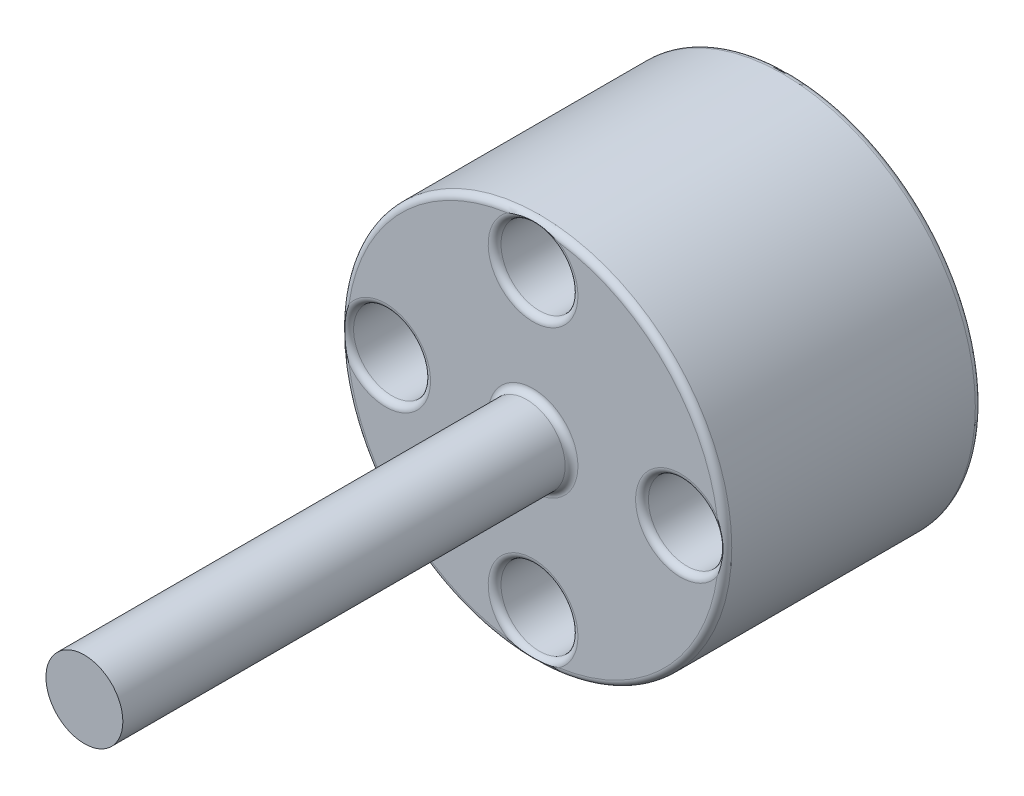
ISO-10303-21;
HEADER;
FILE_DESCRIPTION(('STEP AP214'),'2;1');
FILE_NAME('part.step','',(''),(''),'','','');
FILE_SCHEMA(('AUTOMOTIVE_DESIGN { 1 0 10303 214 1 1 1 1 }'));
ENDSEC;
DATA;
#1=APPLICATION_CONTEXT('core data for automotive mechanical design processes');
#2=APPLICATION_PROTOCOL_DEFINITION('international standard','automotive_design',2000,#1);
#3=PRODUCT_CONTEXT('',#1,'mechanical');
#4=PRODUCT('Part','Part','',(#3));
#5=PRODUCT_RELATED_PRODUCT_CATEGORY('part','',(#4));
#6=PRODUCT_DEFINITION_FORMATION('','',#4);
#7=PRODUCT_DEFINITION_CONTEXT('part definition',#1,'design');
#8=PRODUCT_DEFINITION('design','',#6,#7);
#9=PRODUCT_DEFINITION_SHAPE('','',#8);
#10=(LENGTH_UNIT() NAMED_UNIT(*) SI_UNIT(.MILLI.,.METRE.));
#11=(NAMED_UNIT(*) PLANE_ANGLE_UNIT() SI_UNIT($,.RADIAN.));
#12=(NAMED_UNIT(*) SI_UNIT($,.STERADIAN.) SOLID_ANGLE_UNIT());
#13=UNCERTAINTY_MEASURE_WITH_UNIT(LENGTH_MEASURE(1.E-05),#10,'distance_accuracy_value','');
#14=(GEOMETRIC_REPRESENTATION_CONTEXT(3) GLOBAL_UNCERTAINTY_ASSIGNED_CONTEXT((#13)) GLOBAL_UNIT_ASSIGNED_CONTEXT((#10,
#11,#12)) REPRESENTATION_CONTEXT('',''));
#15=CARTESIAN_POINT('',(0.,0.,0.));
#16=DIRECTION('',(0.,0.,1.));
#17=DIRECTION('',(1.,0.,0.));
#18=AXIS2_PLACEMENT_3D('',#15,#16,#17);
#19=CARTESIAN_POINT('',(0.,0.,2.));
#20=DIRECTION('',(0.,0.,-1.));
#21=DIRECTION('',(-1.,0.,0.));
#22=AXIS2_PLACEMENT_3D('',#19,#20,#21);
#23=CYLINDRICAL_SURFACE('',#22,1.5);
#24=CARTESIAN_POINT('',(0.,0.,0.0499999999999999));
#25=DIRECTION('',(0.,0.,1.));
#26=DIRECTION('',(1.,0.,0.));
#27=AXIS2_PLACEMENT_3D('',#24,#25,#26);
#28=CIRCLE('',#27,1.5);
#29=CARTESIAN_POINT('',(1.5,0.,0.0499999999999999));
#30=VERTEX_POINT('',#29);
#31=EDGE_CURVE('E11',#30,#30,#28,.T.);
#32=ORIENTED_EDGE('',*,*,#31,.T.);
#33=EDGE_LOOP('',(#32));
#34=FACE_BOUND('',#33,.T.);
#35=CARTESIAN_POINT('',(0.,0.,1.95));
#36=DIRECTION('',(0.,0.,1.));
#37=DIRECTION('',(1.,0.,0.));
#38=AXIS2_PLACEMENT_3D('',#35,#36,#37);
#39=CIRCLE('',#38,1.5);
#40=CARTESIAN_POINT('',(1.5,0.,1.95));
#41=VERTEX_POINT('',#40);
#42=EDGE_CURVE('E48',#41,#41,#39,.F.);
#43=ORIENTED_EDGE('',*,*,#42,.T.);
#44=EDGE_LOOP('',(#43));
#45=FACE_BOUND('',#44,.T.);
#46=ADVANCED_FACE('F35',(#34,#45),#23,.T.);
#47=CARTESIAN_POINT('',(0.,0.,2.));
#48=DIRECTION('',(0.,0.,1.));
#49=DIRECTION('',(1.,0.,0.));
#50=AXIS2_PLACEMENT_3D('',#47,#48,#49);
#51=PLANE('',#50);
#52=CARTESIAN_POINT('',(0.,0.,2.));
#53=DIRECTION('',(0.,0.,1.));
#54=DIRECTION('',(1.,0.,0.));
#55=AXIS2_PLACEMENT_3D('',#52,#53,#54);
#56=CIRCLE('',#55,0.35);
#57=CARTESIAN_POINT('',(0.35,0.,2.));
#58=VERTEX_POINT('',#57);
#59=EDGE_CURVE('E181',#58,#58,#56,.F.);
#60=ORIENTED_EDGE('',*,*,#59,.T.);
#61=EDGE_LOOP('',(#60));
#62=FACE_BOUND('',#61,.T.);
#63=CARTESIAN_POINT('',(1.15,0.,2.));
#64=DIRECTION('',(0.,0.,1.));
#65=DIRECTION('',(1.,0.,0.));
#66=AXIS2_PLACEMENT_3D('',#63,#64,#65);
#67=CIRCLE('',#66,0.35);
#68=CARTESIAN_POINT('',(1.43586956521739,-0.201937098331197,2.));
#69=VERTEX_POINT('',#68);
#70=CARTESIAN_POINT('',(1.43586956521739,0.201937098331177,2.));
#71=VERTEX_POINT('',#70);
#72=EDGE_CURVE('E61',#69,#71,#67,.F.);
#73=ORIENTED_EDGE('',*,*,#72,.T.);
#74=CARTESIAN_POINT('',(0.,0.,2.));
#75=DIRECTION('',(0.,0.,1.));
#76=DIRECTION('',(1.,0.,0.));
#77=AXIS2_PLACEMENT_3D('',#74,#75,#76);
#78=CIRCLE('',#77,1.45);
#79=CARTESIAN_POINT('',(0.201937098331192,1.43586956521739,2.));
#80=VERTEX_POINT('',#79);
#81=EDGE_CURVE('E56',#71,#80,#78,.T.);
#82=ORIENTED_EDGE('',*,*,#81,.T.);
#83=CARTESIAN_POINT('',(0.,1.15,2.));
#84=DIRECTION('',(0.,0.,1.));
#85=DIRECTION('',(1.,0.,0.));
#86=AXIS2_PLACEMENT_3D('',#83,#84,#85);
#87=CIRCLE('',#86,0.35);
#88=CARTESIAN_POINT('',(-0.201937098331182,1.43586956521739,2.));
#89=VERTEX_POINT('',#88);
#90=EDGE_CURVE('E178',#80,#89,#87,.F.);
#91=ORIENTED_EDGE('',*,*,#90,.T.);
#92=CARTESIAN_POINT('',(0.,0.,2.));
#93=DIRECTION('',(0.,0.,1.));
#94=DIRECTION('',(1.,0.,0.));
#95=AXIS2_PLACEMENT_3D('',#92,#93,#94);
#96=CIRCLE('',#95,1.45);
#97=CARTESIAN_POINT('',(-1.43586956521739,0.201937098331187,2.));
#98=VERTEX_POINT('',#97);
#99=EDGE_CURVE('E173',#89,#98,#96,.T.);
#100=ORIENTED_EDGE('',*,*,#99,.T.);
#101=CARTESIAN_POINT('',(-1.15,0.,2.));
#102=DIRECTION('',(0.,0.,1.));
#103=DIRECTION('',(1.,0.,0.));
#104=AXIS2_PLACEMENT_3D('',#101,#102,#103);
#105=CIRCLE('',#104,0.35);
#106=CARTESIAN_POINT('',(-1.43586956521739,-0.201937098331187,2.));
#107=VERTEX_POINT('',#106);
#108=EDGE_CURVE('E171',#98,#107,#105,.F.);
#109=ORIENTED_EDGE('',*,*,#108,.T.);
#110=CARTESIAN_POINT('',(0.,0.,2.));
#111=DIRECTION('',(0.,0.,1.));
#112=DIRECTION('',(1.,0.,0.));
#113=AXIS2_PLACEMENT_3D('',#110,#111,#112);
#114=CIRCLE('',#113,1.45);
#115=CARTESIAN_POINT('',(-0.201937098331203,-1.43586956521739,2.));
#116=VERTEX_POINT('',#115);
#117=EDGE_CURVE('E167',#107,#116,#114,.T.);
#118=ORIENTED_EDGE('',*,*,#117,.T.);
#119=CARTESIAN_POINT('',(0.,-1.15,2.));
#120=DIRECTION('',(0.,0.,1.));
#121=DIRECTION('',(1.,0.,0.));
#122=AXIS2_PLACEMENT_3D('',#119,#120,#121);
#123=CIRCLE('',#122,0.35);
#124=CARTESIAN_POINT('',(0.201937098331173,-1.43586956521739,2.));
#125=VERTEX_POINT('',#124);
#126=EDGE_CURVE('E169',#116,#125,#123,.F.);
#127=ORIENTED_EDGE('',*,*,#126,.T.);
#128=CARTESIAN_POINT('',(0.,0.,2.));
#129=DIRECTION('',(0.,0.,1.));
#130=DIRECTION('',(1.,0.,0.));
#131=AXIS2_PLACEMENT_3D('',#128,#129,#130);
#132=CIRCLE('',#131,1.45);
#133=EDGE_CURVE('E175',#125,#69,#132,.T.);
#134=ORIENTED_EDGE('',*,*,#133,.T.);
#135=EDGE_LOOP('',(#73,#82,#91,#100,#109,#118,#127,#134));
#136=FACE_BOUND('',#135,.T.);
#137=ADVANCED_FACE('F284',(#62,#136),#51,.T.);
#138=CARTESIAN_POINT('',(0.,0.,0.));
#139=DIRECTION('',(0.,0.,1.));
#140=DIRECTION('',(1.,0.,0.));
#141=AXIS2_PLACEMENT_3D('',#138,#139,#140);
#142=PLANE('',#141);
#143=CARTESIAN_POINT('',(-1.15,0.,0.));
#144=DIRECTION('',(0.,0.,1.));
#145=DIRECTION('',(1.,0.,0.));
#146=AXIS2_PLACEMENT_3D('',#143,#144,#145);
#147=CIRCLE('',#146,0.35);
#148=CARTESIAN_POINT('',(-1.43586956521739,-0.201937098331187,0.));
#149=VERTEX_POINT('',#148);
#150=CARTESIAN_POINT('',(-1.43586956521739,0.201937098331187,0.));
#151=VERTEX_POINT('',#150);
#152=EDGE_CURVE('E137',#149,#151,#147,.T.);
#153=ORIENTED_EDGE('',*,*,#152,.T.);
#154=CARTESIAN_POINT('',(0.,0.,0.));
#155=DIRECTION('',(0.,0.,1.));
#156=DIRECTION('',(1.,0.,0.));
#157=AXIS2_PLACEMENT_3D('',#154,#155,#156);
#158=CIRCLE('',#157,1.45);
#159=CARTESIAN_POINT('',(-0.201937098331182,1.43586956521739,0.));
#160=VERTEX_POINT('',#159);
#161=EDGE_CURVE('E141',#151,#160,#158,.F.);
#162=ORIENTED_EDGE('',*,*,#161,.T.);
#163=CARTESIAN_POINT('',(0.,1.15,0.));
#164=DIRECTION('',(0.,0.,1.));
#165=DIRECTION('',(1.,0.,0.));
#166=AXIS2_PLACEMENT_3D('',#163,#164,#165);
#167=CIRCLE('',#166,0.35);
#168=CARTESIAN_POINT('',(0.201937098331192,1.43586956521739,0.));
#169=VERTEX_POINT('',#168);
#170=EDGE_CURVE('E139',#160,#169,#167,.T.);
#171=ORIENTED_EDGE('',*,*,#170,.T.);
#172=CARTESIAN_POINT('',(0.,0.,0.));
#173=DIRECTION('',(0.,0.,1.));
#174=DIRECTION('',(1.,0.,0.));
#175=AXIS2_PLACEMENT_3D('',#172,#173,#174);
#176=CIRCLE('',#175,1.45);
#177=CARTESIAN_POINT('',(1.43586956521739,0.201937098331177,0.));
#178=VERTEX_POINT('',#177);
#179=EDGE_CURVE('E113',#169,#178,#176,.F.);
#180=ORIENTED_EDGE('',*,*,#179,.T.);
#181=CARTESIAN_POINT('',(1.15,0.,0.));
#182=DIRECTION('',(0.,0.,1.));
#183=DIRECTION('',(1.,0.,0.));
#184=AXIS2_PLACEMENT_3D('',#181,#182,#183);
#185=CIRCLE('',#184,0.35);
#186=CARTESIAN_POINT('',(1.43586956521739,-0.201937098331197,0.));
#187=VERTEX_POINT('',#186);
#188=EDGE_CURVE('E105',#178,#187,#185,.T.);
#189=ORIENTED_EDGE('',*,*,#188,.T.);
#190=CARTESIAN_POINT('',(0.,0.,0.));
#191=DIRECTION('',(0.,0.,1.));
#192=DIRECTION('',(1.,0.,0.));
#193=AXIS2_PLACEMENT_3D('',#190,#191,#192);
#194=CIRCLE('',#193,1.45);
#195=CARTESIAN_POINT('',(0.201937098331173,-1.43586956521739,0.));
#196=VERTEX_POINT('',#195);
#197=EDGE_CURVE('E109',#187,#196,#194,.F.);
#198=ORIENTED_EDGE('',*,*,#197,.T.);
#199=CARTESIAN_POINT('',(0.,-1.15,0.));
#200=DIRECTION('',(0.,0.,1.));
#201=DIRECTION('',(1.,0.,0.));
#202=AXIS2_PLACEMENT_3D('',#199,#200,#201);
#203=CIRCLE('',#202,0.35);
#204=CARTESIAN_POINT('',(-0.201937098331203,-1.43586956521739,0.));
#205=VERTEX_POINT('',#204);
#206=EDGE_CURVE('E116',#196,#205,#203,.T.);
#207=ORIENTED_EDGE('',*,*,#206,.T.);
#208=CARTESIAN_POINT('',(0.,0.,0.));
#209=DIRECTION('',(0.,0.,1.));
#210=DIRECTION('',(1.,0.,0.));
#211=AXIS2_PLACEMENT_3D('',#208,#209,#210);
#212=CIRCLE('',#211,1.45);
#213=EDGE_CURVE('E135',#205,#149,#212,.F.);
#214=ORIENTED_EDGE('',*,*,#213,.T.);
#215=EDGE_LOOP('',(#153,#162,#171,#180,#189,#198,#207,#214));
#216=FACE_BOUND('',#215,.T.);
#217=ADVANCED_FACE('F107',(#216),#142,.F.);
#218=CARTESIAN_POINT('',(0.,1.15,-1.));
#219=DIRECTION('',(0.,0.,1.));
#220=DIRECTION('',(1.,0.,0.));
#221=AXIS2_PLACEMENT_3D('',#218,#219,#220);
#222=CYLINDRICAL_SURFACE('',#221,0.3);
#223=CARTESIAN_POINT('',(0.,1.15,0.0499999999999999));
#224=DIRECTION('',(0.,0.,1.));
#225=DIRECTION('',(1.,0.,0.));
#226=AXIS2_PLACEMENT_3D('',#223,#224,#225);
#227=CIRCLE('',#226,0.3);
#228=CARTESIAN_POINT('',(0.300000000000004,1.15,0.0499999999999999));
#229=VERTEX_POINT('',#228);
#230=EDGE_CURVE('E146',#229,#229,#227,.F.);
#231=ORIENTED_EDGE('',*,*,#230,.T.);
#232=EDGE_LOOP('',(#231));
#233=FACE_BOUND('',#232,.T.);
#234=CARTESIAN_POINT('',(0.,1.15,1.95));
#235=DIRECTION('',(0.,0.,1.));
#236=DIRECTION('',(1.,0.,0.));
#237=AXIS2_PLACEMENT_3D('',#234,#235,#236);
#238=CIRCLE('',#237,0.3);
#239=CARTESIAN_POINT('',(0.300000000000004,1.15,1.95));
#240=VERTEX_POINT('',#239);
#241=EDGE_CURVE('E143',#240,#240,#238,.T.);
#242=ORIENTED_EDGE('',*,*,#241,.T.);
#243=EDGE_LOOP('',(#242));
#244=FACE_BOUND('',#243,.T.);
#245=ADVANCED_FACE('F294',(#233,#244),#222,.F.);
#246=CARTESIAN_POINT('',(-1.15,0.,-1.));
#247=DIRECTION('',(0.,0.,1.));
#248=DIRECTION('',(1.,0.,0.));
#249=AXIS2_PLACEMENT_3D('',#246,#247,#248);
#250=CYLINDRICAL_SURFACE('',#249,0.3);
#251=CARTESIAN_POINT('',(-1.15,0.,0.0499999999999999));
#252=DIRECTION('',(0.,0.,1.));
#253=DIRECTION('',(1.,0.,0.));
#254=AXIS2_PLACEMENT_3D('',#251,#252,#253);
#255=CIRCLE('',#254,0.3);
#256=CARTESIAN_POINT('',(-0.85,0.,0.0499999999999999));
#257=VERTEX_POINT('',#256);
#258=EDGE_CURVE('E152',#257,#257,#255,.F.);
#259=ORIENTED_EDGE('',*,*,#258,.T.);
#260=EDGE_LOOP('',(#259));
#261=FACE_BOUND('',#260,.T.);
#262=CARTESIAN_POINT('',(-1.15,0.,1.95));
#263=DIRECTION('',(0.,0.,1.));
#264=DIRECTION('',(1.,0.,0.));
#265=AXIS2_PLACEMENT_3D('',#262,#263,#264);
#266=CIRCLE('',#265,0.3);
#267=CARTESIAN_POINT('',(-0.85,0.,1.95));
#268=VERTEX_POINT('',#267);
#269=EDGE_CURVE('E149',#268,#268,#266,.T.);
#270=ORIENTED_EDGE('',*,*,#269,.T.);
#271=EDGE_LOOP('',(#270));
#272=FACE_BOUND('',#271,.T.);
#273=ADVANCED_FACE('F298',(#261,#272),#250,.F.);
#274=CARTESIAN_POINT('',(1.15,0.,-1.));
#275=DIRECTION('',(0.,0.,1.));
#276=DIRECTION('',(1.,0.,0.));
#277=AXIS2_PLACEMENT_3D('',#274,#275,#276);
#278=CYLINDRICAL_SURFACE('',#277,0.3);
#279=CARTESIAN_POINT('',(1.15,0.,0.0499999999999999));
#280=DIRECTION('',(0.,0.,1.));
#281=DIRECTION('',(1.,0.,0.));
#282=AXIS2_PLACEMENT_3D('',#279,#280,#281);
#283=CIRCLE('',#282,0.3);
#284=CARTESIAN_POINT('',(1.45,0.,0.0499999999999999));
#285=VERTEX_POINT('',#284);
#286=EDGE_CURVE('E158',#285,#285,#283,.F.);
#287=ORIENTED_EDGE('',*,*,#286,.T.);
#288=EDGE_LOOP('',(#287));
#289=FACE_BOUND('',#288,.T.);
#290=CARTESIAN_POINT('',(1.15,0.,1.95));
#291=DIRECTION('',(0.,0.,1.));
#292=DIRECTION('',(1.,0.,0.));
#293=AXIS2_PLACEMENT_3D('',#290,#291,#292);
#294=CIRCLE('',#293,0.3);
#295=CARTESIAN_POINT('',(1.45,0.,1.95));
#296=VERTEX_POINT('',#295);
#297=EDGE_CURVE('E155',#296,#296,#294,.T.);
#298=ORIENTED_EDGE('',*,*,#297,.T.);
#299=EDGE_LOOP('',(#298));
#300=FACE_BOUND('',#299,.T.);
#301=ADVANCED_FACE('F302',(#289,#300),#278,.F.);
#302=CARTESIAN_POINT('',(0.,-1.15,-1.));
#303=DIRECTION('',(0.,0.,1.));
#304=DIRECTION('',(1.,0.,0.));
#305=AXIS2_PLACEMENT_3D('',#302,#303,#304);
#306=CYLINDRICAL_SURFACE('',#305,0.3);
#307=CARTESIAN_POINT('',(0.,-1.15,0.0499999999999999));
#308=DIRECTION('',(0.,0.,1.));
#309=DIRECTION('',(1.,0.,0.));
#310=AXIS2_PLACEMENT_3D('',#307,#308,#309);
#311=CIRCLE('',#310,0.3);
#312=CARTESIAN_POINT('',(0.299999999999988,-1.15,0.0499999999999999));
#313=VERTEX_POINT('',#312);
#314=EDGE_CURVE('E164',#313,#313,#311,.F.);
#315=ORIENTED_EDGE('',*,*,#314,.T.);
#316=EDGE_LOOP('',(#315));
#317=FACE_BOUND('',#316,.T.);
#318=CARTESIAN_POINT('',(0.,-1.15,1.95));
#319=DIRECTION('',(0.,0.,1.));
#320=DIRECTION('',(1.,0.,0.));
#321=AXIS2_PLACEMENT_3D('',#318,#319,#320);
#322=CIRCLE('',#321,0.3);
#323=CARTESIAN_POINT('',(0.299999999999988,-1.15,1.95));
#324=VERTEX_POINT('',#323);
#325=EDGE_CURVE('E161',#324,#324,#322,.T.);
#326=ORIENTED_EDGE('',*,*,#325,.T.);
#327=EDGE_LOOP('',(#326));
#328=FACE_BOUND('',#327,.T.);
#329=ADVANCED_FACE('F306',(#317,#328),#306,.F.);
#330=CARTESIAN_POINT('',(0.,0.,5.5));
#331=DIRECTION('',(0.,0.,-1.));
#332=DIRECTION('',(-1.,0.,0.));
#333=AXIS2_PLACEMENT_3D('',#330,#331,#332);
#334=CYLINDRICAL_SURFACE('',#333,0.3);
#335=CARTESIAN_POINT('',(0.,0.,2.05));
#336=DIRECTION('',(0.,0.,1.));
#337=DIRECTION('',(1.,0.,0.));
#338=AXIS2_PLACEMENT_3D('',#335,#336,#337);
#339=CIRCLE('',#338,0.3);
#340=CARTESIAN_POINT('',(0.3,0.,2.05));
#341=VERTEX_POINT('',#340);
#342=EDGE_CURVE('E184',#341,#341,#339,.T.);
#343=ORIENTED_EDGE('',*,*,#342,.T.);
#344=EDGE_LOOP('',(#343));
#345=FACE_BOUND('',#344,.T.);
#346=CARTESIAN_POINT('',(0.,0.,5.5));
#347=DIRECTION('',(0.,0.,1.));
#348=DIRECTION('',(1.,0.,0.));
#349=AXIS2_PLACEMENT_3D('',#346,#347,#348);
#350=CIRCLE('',#349,0.3);
#351=CARTESIAN_POINT('',(0.3,0.,5.5));
#352=VERTEX_POINT('',#351);
#353=EDGE_CURVE('E121',#352,#352,#350,.T.);
#354=ORIENTED_EDGE('',*,*,#353,.F.);
#355=EDGE_LOOP('',(#354));
#356=FACE_BOUND('',#355,.T.);
#357=ADVANCED_FACE('F310',(#345,#356),#334,.T.);
#358=CARTESIAN_POINT('',(0.,0.,5.5));
#359=DIRECTION('',(0.,0.,1.));
#360=DIRECTION('',(1.,0.,0.));
#361=AXIS2_PLACEMENT_3D('',#358,#359,#360);
#362=PLANE('',#361);
#363=ORIENTED_EDGE('',*,*,#353,.T.);
#364=EDGE_LOOP('',(#363));
#365=FACE_BOUND('',#364,.T.);
#366=ADVANCED_FACE('F242',(#365),#362,.T.);
#367=CARTESIAN_POINT('',(1.15,0.,0.0499999999999999));
#368=DIRECTION('',(0.,0.,1.));
#369=DIRECTION('',(1.,0.,0.));
#370=AXIS2_PLACEMENT_3D('',#367,#368,#369);
#371=TOROIDAL_SURFACE('',#370,0.35,0.05);
#372=ORIENTED_EDGE('',*,*,#286,.F.);
#373=EDGE_LOOP('',(#372));
#374=FACE_BOUND('',#373,.T.);
#375=CARTESIAN_POINT('',(1.43586956521739,-0.201937098331198,0.));
#376=CARTESIAN_POINT('',(1.43612634153744,-0.201289268184827,1.12791402955893E-08));
#377=CARTESIAN_POINT('',(1.43638195279791,-0.200640961265069,8.17622507175354E-07));
#378=CARTESIAN_POINT('',(1.44275013630169,-0.184403345825394,4.04246720203178E-05));
#379=CARTESIAN_POINT('',(1.44818914714311,-0.168542223917562,0.000526564702538975));
#380=CARTESIAN_POINT('',(1.45762581674346,-0.136389331563745,0.00187201254583861));
#381=CARTESIAN_POINT('',(1.46162084194712,-0.12009683184701,0.00273199595092352));
#382=CARTESIAN_POINT('',(1.46768296661211,-0.0892960083221013,0.00427608932695745));
#383=CARTESIAN_POINT('',(1.46993040489774,-0.0748236904997125,0.00496866790024452));
#384=CARTESIAN_POINT('',(1.47323493196302,-0.0457332837419883,0.00605048074632255));
#385=CARTESIAN_POINT('',(1.47429224007455,-0.0311152221672446,0.00643977090876729));
#386=CARTESIAN_POINT('',(1.4751981216962,-0.00183411451243005,0.00677051651445692));
#387=CARTESIAN_POINT('',(1.47504656846501,0.0128289361233494,0.00671192500022595));
#388=CARTESIAN_POINT('',(1.47353772456414,0.0420805911423185,0.00616959317882667));
#389=CARTESIAN_POINT('',(1.47218062216764,0.0566692067923932,0.00568591925781572));
#390=CARTESIAN_POINT('',(1.46756214595278,0.0910482283294351,0.00424387340364925));
#391=CARTESIAN_POINT('',(1.4637817778277,0.110764863478096,0.00317605207512468));
#392=CARTESIAN_POINT('',(1.45410065794233,0.149653589950277,0.00126818731673808));
#393=CARTESIAN_POINT('',(1.44820344993497,0.168826533916593,0.000427767298987984));
#394=CARTESIAN_POINT('',(1.43980612625028,0.191772624671087,5.40282333038937E-05));
#395=CARTESIAN_POINT('',(1.43824465498474,0.195891506099508,1.24823253110957E-05));
#396=CARTESIAN_POINT('',(1.43638195535113,0.200640944478411,8.05200992356022E-07));
#397=CARTESIAN_POINT('',(1.43612634402928,0.201289250493394,-2.32826666588271E-09));
#398=CARTESIAN_POINT('',(1.43586956521739,0.201937098331177,0.));
#399=B_SPLINE_CURVE_WITH_KNOTS('',3,(#375,#376,#377,#378,#379,#380,#381,#382,#383,#384,#385,
#386,#387,#388,#389,#390,#391,#392,#393,#394,#395,#396,#397,#398),.UNSPECIFIED.,.F.,.F.,(4,2,2,
2,2,2,2,2,2,2,2,4),(0.,0.00209062932104279,0.0523242262657676,0.102648982883692,
0.146586460966601,0.190515840383101,0.234449825571998,0.278376950702154,0.338566935362562,
0.398656623722513,0.41187102163676,0.413961650960952),.UNSPECIFIED.);
#400=EDGE_CURVE('E118',#187,#178,#399,.T.);
#401=ORIENTED_EDGE('',*,*,#400,.F.);
#402=ORIENTED_EDGE('',*,*,#188,.F.);
#403=EDGE_LOOP('',(#401,#402));
#404=FACE_BOUND('',#403,.T.);
#405=ADVANCED_FACE('F119',(#374,#404),#371,.T.);
#406=CARTESIAN_POINT('',(0.,-1.15,0.0499999999999999));
#407=DIRECTION('',(0.,0.,1.));
#408=DIRECTION('',(1.,0.,0.));
#409=AXIS2_PLACEMENT_3D('',#406,#407,#408);
#410=TOROIDAL_SURFACE('',#409,0.35,0.05);
#411=ORIENTED_EDGE('',*,*,#314,.F.);
#412=EDGE_LOOP('',(#411));
#413=FACE_BOUND('',#412,.T.);
#414=CARTESIAN_POINT('',(-0.201937098331203,-1.43586956521739,0.));
#415=CARTESIAN_POINT('',(-0.201289268184834,-1.43612634153744,1.12791840049309E-08));
#416=CARTESIAN_POINT('',(-0.200640961265076,-1.43638195279791,8.17622528266505E-07));
#417=CARTESIAN_POINT('',(-0.184403345825408,-1.44275013630169,4.0424671513385E-05));
#418=CARTESIAN_POINT('',(-0.168542223917583,-1.44818914714311,0.000526564702403194));
#419=CARTESIAN_POINT('',(-0.136389331563766,-1.45762581674346,0.00187201254597333));
#420=CARTESIAN_POINT('',(-0.120096831847025,-1.46162084194711,0.00273199595095703));
#421=CARTESIAN_POINT('',(-0.0892960083221094,-1.46768296661211,0.0042760893269276));
#422=CARTESIAN_POINT('',(-0.0748236904997207,-1.46993040489773,0.00496866790023649));
#423=CARTESIAN_POINT('',(-0.0457332837419956,-1.47323493196302,0.00605048074633053));
#424=CARTESIAN_POINT('',(-0.0311152221672511,-1.47429224007454,0.00643977090876945));
#425=CARTESIAN_POINT('',(-0.00183411451243592,-1.4751981216962,0.00677051651445479));
#426=CARTESIAN_POINT('',(0.0128289361233433,-1.47504656846501,0.0067119250002254));
#427=CARTESIAN_POINT('',(0.0420805911423118,-1.47353772456414,0.00616959317882731));
#428=CARTESIAN_POINT('',(0.0566692067923864,-1.47218062216764,0.00568591925781597));
#429=CARTESIAN_POINT('',(0.091048228329429,-1.46756214595278,0.00424387340364907));
#430=CARTESIAN_POINT('',(0.110764863478091,-1.4637817778277,0.00317605207512463));
#431=CARTESIAN_POINT('',(0.149653589950273,-1.45410065794233,0.00126818731673813));
#432=CARTESIAN_POINT('',(0.168826533916589,-1.44820344993497,0.00042776729898798));
#433=CARTESIAN_POINT('',(0.191772624671082,-1.43980612625028,5.40282333038956E-05));
#434=CARTESIAN_POINT('',(0.195891506099503,-1.43824465498474,1.24823253111013E-05));
#435=CARTESIAN_POINT('',(0.200640944478406,-1.43638195535113,8.05200992354519E-07));
#436=CARTESIAN_POINT('',(0.201289250493389,-1.43612634402929,-2.32826666860033E-09));
#437=CARTESIAN_POINT('',(0.201937098331173,-1.43586956521739,0.));
#438=B_SPLINE_CURVE_WITH_KNOTS('',3,(#414,#415,#416,#417,#418,#419,#420,#421,#422,#423,#424,
#425,#426,#427,#428,#429,#430,#431,#432,#433,#434,#435,#436,#437),.UNSPECIFIED.,.F.,.F.,(4,2,2,
2,2,2,2,2,2,2,2,4),(0.,0.00209062932103901,0.052324226265744,0.102648982883688,
0.146586460966598,0.190515840383101,0.234449825571997,0.278376950702152,0.338566935362563,
0.398656623722514,0.411871021636761,0.413961650960953),.UNSPECIFIED.);
#439=EDGE_CURVE('E122',#205,#196,#438,.T.);
#440=ORIENTED_EDGE('',*,*,#439,.F.);
#441=ORIENTED_EDGE('',*,*,#206,.F.);
#442=EDGE_LOOP('',(#440,#441));
#443=FACE_BOUND('',#442,.T.);
#444=ADVANCED_FACE('F218',(#413,#443),#410,.T.);
#445=CARTESIAN_POINT('',(-1.15,0.,0.0499999999999999));
#446=DIRECTION('',(0.,0.,1.));
#447=DIRECTION('',(1.,0.,0.));
#448=AXIS2_PLACEMENT_3D('',#445,#446,#447);
#449=TOROIDAL_SURFACE('',#448,0.35,0.05);
#450=ORIENTED_EDGE('',*,*,#258,.F.);
#451=EDGE_LOOP('',(#450));
#452=FACE_BOUND('',#451,.T.);
#453=CARTESIAN_POINT('',(-1.43586956521739,0.201937098331187,0.));
#454=CARTESIAN_POINT('',(-1.43612634153744,0.201289268184818,1.12791840245291E-08));
#455=CARTESIAN_POINT('',(-1.43638195279791,0.200640961265061,8.17622528271499E-07));
#456=CARTESIAN_POINT('',(-1.44275013630169,0.184403345825393,4.04246715130482E-05));
#457=CARTESIAN_POINT('',(-1.44818914714311,0.168542223917568,0.000526564702403076));
#458=CARTESIAN_POINT('',(-1.45762581674346,0.136389331563751,0.00187201254597336));
#459=CARTESIAN_POINT('',(-1.46162084194712,0.12009683184701,0.00273199595095699));
#460=CARTESIAN_POINT('',(-1.46768296661211,0.0892960083220947,0.00427608932692751));
#461=CARTESIAN_POINT('',(-1.46993040489774,0.0748236904997057,0.00496866790023641));
#462=CARTESIAN_POINT('',(-1.47323493196302,0.0457332837419801,0.00605048074633047));
#463=CARTESIAN_POINT('',(-1.47429224007455,0.0311152221672354,0.00643977090876942));
#464=CARTESIAN_POINT('',(-1.4751981216962,0.00183411451242001,0.00677051651445481));
#465=CARTESIAN_POINT('',(-1.47504656846501,-0.0128289361233592,0.00671192500022545));
#466=CARTESIAN_POINT('',(-1.47353772456414,-0.0420805911423278,0.00616959317882733));
#467=CARTESIAN_POINT('',(-1.47218062216764,-0.0566692067924024,0.00568591925781594));
#468=CARTESIAN_POINT('',(-1.46756214595278,-0.0910482283294448,0.00424387340364902));
#469=CARTESIAN_POINT('',(-1.46378177782769,-0.110764863478106,0.00317605207512465));
#470=CARTESIAN_POINT('',(-1.45410065794233,-0.149653589950288,0.00126818731673811));
#471=CARTESIAN_POINT('',(-1.44820344993497,-0.168826533916603,0.000427767298987851));
#472=CARTESIAN_POINT('',(-1.43980612625028,-0.191772624671096,5.40282333039323E-05));
#473=CARTESIAN_POINT('',(-1.43824465498474,-0.195891506099518,1.24823253111796E-05));
#474=CARTESIAN_POINT('',(-1.43638195535112,-0.200640944478421,8.05200992352326E-07));
#475=CARTESIAN_POINT('',(-1.43612634402928,-0.201289250493404,-2.32826668459592E-09));
#476=CARTESIAN_POINT('',(-1.43586956521739,-0.201937098331187,0.));
#477=B_SPLINE_CURVE_WITH_KNOTS('',3,(#453,#454,#455,#456,#457,#458,#459,#460,#461,#462,#463,
#464,#465,#466,#467,#468,#469,#470,#471,#472,#473,#474,#475,#476),.UNSPECIFIED.,.F.,.F.,(4,2,2,
2,2,2,2,2,2,2,2,4),(0.,0.00209062932103899,0.0523242262657429,0.102648982883687,
0.146586460966597,0.190515840383101,0.234449825571997,0.278376950702152,0.338566935362562,
0.398656623722512,0.41187102163676,0.413961650960951),.UNSPECIFIED.);
#478=EDGE_CURVE('E196',#151,#149,#477,.T.);
#479=ORIENTED_EDGE('',*,*,#478,.F.);
#480=ORIENTED_EDGE('',*,*,#152,.F.);
#481=EDGE_LOOP('',(#479,#480));
#482=FACE_BOUND('',#481,.T.);
#483=ADVANCED_FACE('F209',(#452,#482),#449,.T.);
#484=CARTESIAN_POINT('',(0.,0.,0.0499999999999999));
#485=DIRECTION('',(0.,0.,1.));
#486=DIRECTION('',(1.,0.,0.));
#487=AXIS2_PLACEMENT_3D('',#484,#485,#486);
#488=TOROIDAL_SURFACE('',#487,1.45,0.05);
#489=ORIENTED_EDGE('',*,*,#31,.F.);
#490=EDGE_LOOP('',(#489));
#491=FACE_BOUND('',#490,.T.);
#492=CARTESIAN_POINT('',(-0.201937098331182,1.43586956521739,0.));
#493=CARTESIAN_POINT('',(-0.201289268184812,1.43612634153744,1.1279140292647E-08));
#494=CARTESIAN_POINT('',(-0.200640961265053,1.43638195279791,8.17622507171679E-07));
#495=CARTESIAN_POINT('',(-0.184403345825378,1.44275013630169,4.04246720202967E-05));
#496=CARTESIAN_POINT('',(-0.168542223917546,1.44818914714312,0.000526564702538959));
#497=CARTESIAN_POINT('',(-0.136389331563729,1.45762581674346,0.0018720125458386));
#498=CARTESIAN_POINT('',(-0.120096831846994,1.46162084194712,0.00273199595092352));
#499=CARTESIAN_POINT('',(-0.0892960083220857,1.46768296661211,0.00427608932695745));
#500=CARTESIAN_POINT('',(-0.0748236904996971,1.46993040489774,0.00496866790024453));
#501=CARTESIAN_POINT('',(-0.0457332837419731,1.47323493196302,0.00605048074632251));
#502=CARTESIAN_POINT('',(-0.0311152221672295,1.47429224007455,0.00643977090876721));
#503=CARTESIAN_POINT('',(-0.00183411451241504,1.4751981216962,0.00677051651445682));
#504=CARTESIAN_POINT('',(0.0128289361233645,1.47504656846501,0.00671192500022587));
#505=CARTESIAN_POINT('',(0.0420805911423336,1.47353772456414,0.00616959317882661));
#506=CARTESIAN_POINT('',(0.0566692067924084,1.47218062216764,0.00568591925781566));
#507=CARTESIAN_POINT('',(0.0910482283294503,1.46756214595278,0.00424387340364919));
#508=CARTESIAN_POINT('',(0.110764863478111,1.46378177782769,0.00317605207512462));
#509=CARTESIAN_POINT('',(0.149653589950293,1.45410065794233,0.00126818731673805));
#510=CARTESIAN_POINT('',(0.168826533916609,1.44820344993497,0.000427767298987955));
#511=CARTESIAN_POINT('',(0.191772624671101,1.43980612625028,5.40282333039089E-05));
#512=CARTESIAN_POINT('',(0.195891506099522,1.43824465498473,1.24823253111202E-05));
#513=CARTESIAN_POINT('',(0.200640944478425,1.43638195535112,8.05200992359305E-07));
#514=CARTESIAN_POINT('',(0.201289250493408,1.43612634402928,-2.32826666619648E-09));
#515=CARTESIAN_POINT('',(0.201937098331192,1.43586956521739,0.));
#516=B_SPLINE_CURVE_WITH_KNOTS('',3,(#492,#493,#494,#495,#496,#497,#498,#499,#500,#501,#502,
#503,#504,#505,#506,#507,#508,#509,#510,#511,#512,#513,#514,#515),.UNSPECIFIED.,.F.,.F.,(4,2,2,
2,2,2,2,2,2,2,2,4),(0.,0.00209062932104279,0.0523242262657674,0.102648982883691,0.1465864609666,
0.1905158403831,0.234449825571997,0.278376950702153,0.338566935362562,0.398656623722512,
0.411871021636759,0.413961650960951),.UNSPECIFIED.);
#517=EDGE_CURVE('E189',#160,#169,#516,.T.);
#518=ORIENTED_EDGE('',*,*,#517,.F.);
#519=ORIENTED_EDGE('',*,*,#161,.F.);
#520=ORIENTED_EDGE('',*,*,#478,.T.);
#521=ORIENTED_EDGE('',*,*,#213,.F.);
#522=ORIENTED_EDGE('',*,*,#439,.T.);
#523=ORIENTED_EDGE('',*,*,#197,.F.);
#524=ORIENTED_EDGE('',*,*,#400,.T.);
#525=ORIENTED_EDGE('',*,*,#179,.F.);
#526=EDGE_LOOP('',(#518,#519,#520,#521,#522,#523,#524,#525));
#527=FACE_BOUND('',#526,.T.);
#528=ADVANCED_FACE('F126',(#491,#527),#488,.T.);
#529=CARTESIAN_POINT('',(0.,1.15,0.0499999999999999));
#530=DIRECTION('',(0.,0.,1.));
#531=DIRECTION('',(1.,0.,0.));
#532=AXIS2_PLACEMENT_3D('',#529,#530,#531);
#533=TOROIDAL_SURFACE('',#532,0.35,0.05);
#534=ORIENTED_EDGE('',*,*,#230,.F.);
#535=EDGE_LOOP('',(#534));
#536=FACE_BOUND('',#535,.T.);
#537=ORIENTED_EDGE('',*,*,#170,.F.);
#538=ORIENTED_EDGE('',*,*,#517,.T.);
#539=EDGE_LOOP('',(#537,#538));
#540=FACE_BOUND('',#539,.T.);
#541=ADVANCED_FACE('F208',(#536,#540),#533,.T.);
#542=CARTESIAN_POINT('',(-1.15,0.,1.95));
#543=DIRECTION('',(0.,0.,1.));
#544=DIRECTION('',(1.,0.,0.));
#545=AXIS2_PLACEMENT_3D('',#542,#543,#544);
#546=TOROIDAL_SURFACE('',#545,0.35,0.05);
#547=ORIENTED_EDGE('',*,*,#269,.F.);
#548=EDGE_LOOP('',(#547));
#549=FACE_BOUND('',#548,.T.);
#550=CARTESIAN_POINT('',(-1.43586956521739,-0.201937098331187,2.));
#551=CARTESIAN_POINT('',(-1.43612634153744,-0.201289268184817,1.99999998872082));
#552=CARTESIAN_POINT('',(-1.4363819527979,-0.200640961265058,1.99999918237747));
#553=CARTESIAN_POINT('',(-1.44275013630161,-0.184403345825349,1.99995957532848));
#554=CARTESIAN_POINT('',(-1.44818914714309,-0.168542223917538,1.9994734352976));
#555=CARTESIAN_POINT('',(-1.45762581674349,-0.136389331563723,1.99812798745403));
#556=CARTESIAN_POINT('',(-1.46162084194713,-0.12009683184697,1.99726800404904));
#557=CARTESIAN_POINT('',(-1.46768296661211,-0.0892960083220498,1.99572391067307));
#558=CARTESIAN_POINT('',(-1.46993040489774,-0.0748236904996665,1.99503133209976));
#559=CARTESIAN_POINT('',(-1.47323493196303,-0.0457332837419516,1.99394951925367));
#560=CARTESIAN_POINT('',(-1.47429224007455,-0.031115222167212,1.99356022909123));
#561=CARTESIAN_POINT('',(-1.47519812169619,-0.00183411451239874,1.99322948348555));
#562=CARTESIAN_POINT('',(-1.47504656846501,0.0128289361233835,1.99328807499977));
#563=CARTESIAN_POINT('',(-1.47353772456413,0.0420805911423588,1.99383040682117));
#564=CARTESIAN_POINT('',(-1.47218062216764,0.0566692067924371,1.99431408074219));
#565=CARTESIAN_POINT('',(-1.46756214595277,0.0910482283294782,1.99575612659635));
#566=CARTESIAN_POINT('',(-1.46378177782767,0.110764863478134,1.99682394792488));
#567=CARTESIAN_POINT('',(-1.45410065794233,0.149653589950314,1.99873181268326));
#568=CARTESIAN_POINT('',(-1.44820344993502,0.168826533916634,1.99957223270101));
#569=CARTESIAN_POINT('',(-1.43980612625027,0.191772624671094,1.9999459717667));
#570=CARTESIAN_POINT('',(-1.43824465498471,0.195891506099508,1.99998751767469));
#571=CARTESIAN_POINT('',(-1.43638195535112,0.200640944478417,1.99999919479901));
#572=CARTESIAN_POINT('',(-1.43612634402928,0.201289250493402,2.00000000232827));
#573=CARTESIAN_POINT('',(-1.43586956521739,0.201937098331187,2.));
#574=B_SPLINE_CURVE_WITH_KNOTS('',3,(#550,#551,#552,#553,#554,#555,#556,#557,#558,#559,#560,
#561,#562,#563,#564,#565,#566,#567,#568,#569,#570,#571,#572,#573),.UNSPECIFIED.,.F.,.F.,(4,2,2,
2,2,2,2,2,2,2,2,4),(0.,0.00209062932103903,0.0523242262657759,0.102648982883734,
0.146586460966631,0.190515840383118,0.234449825572024,0.278376950702189,0.338566935362593,
0.398656623722515,0.411871021636759,0.41396165096095),.UNSPECIFIED.);
#575=EDGE_CURVE('E39',#107,#98,#574,.T.);
#576=ORIENTED_EDGE('',*,*,#575,.F.);
#577=ORIENTED_EDGE('',*,*,#108,.F.);
#578=EDGE_LOOP('',(#576,#577));
#579=FACE_BOUND('',#578,.T.);
#580=ADVANCED_FACE('F212',(#549,#579),#546,.T.);
#581=CARTESIAN_POINT('',(0.,-1.15,1.95));
#582=DIRECTION('',(0.,0.,1.));
#583=DIRECTION('',(1.,0.,0.));
#584=AXIS2_PLACEMENT_3D('',#581,#582,#583);
#585=TOROIDAL_SURFACE('',#584,0.35,0.05);
#586=ORIENTED_EDGE('',*,*,#325,.F.);
#587=EDGE_LOOP('',(#586));
#588=FACE_BOUND('',#587,.T.);
#589=CARTESIAN_POINT('',(0.201937098331173,-1.43586956521739,2.));
#590=CARTESIAN_POINT('',(0.201289268184802,-1.43612634153744,1.99999998872082));
#591=CARTESIAN_POINT('',(0.200640961265043,-1.43638195279791,1.99999918237747));
#592=CARTESIAN_POINT('',(0.184403345825333,-1.44275013630161,1.99995957532849));
#593=CARTESIAN_POINT('',(0.168542223917522,-1.4481891471431,1.9994734352976));
#594=CARTESIAN_POINT('',(0.136389331563708,-1.45762581674349,1.99812798745402));
#595=CARTESIAN_POINT('',(0.120096831846955,-1.46162084194713,1.99726800404904));
#596=CARTESIAN_POINT('',(0.0892960083220342,-1.46768296661212,1.99572391067307));
#597=CARTESIAN_POINT('',(0.074823690499651,-1.46993040489774,1.99503133209976));
#598=CARTESIAN_POINT('',(0.0457332837419362,-1.47323493196303,1.99394951925367));
#599=CARTESIAN_POINT('',(0.0311152221671966,-1.47429224007455,1.99356022909123));
#600=CARTESIAN_POINT('',(0.00183411451238344,-1.47519812169619,1.99322948348555));
#601=CARTESIAN_POINT('',(-0.0128289361233988,-1.47504656846501,1.99328807499977));
#602=CARTESIAN_POINT('',(-0.0420805911423741,-1.47353772456413,1.99383040682117));
#603=CARTESIAN_POINT('',(-0.0566692067924523,-1.47218062216763,1.99431408074219));
#604=CARTESIAN_POINT('',(-0.0910482283294935,-1.46756214595277,1.99575612659635));
#605=CARTESIAN_POINT('',(-0.110764863478149,-1.46378177782767,1.99682394792488));
#606=CARTESIAN_POINT('',(-0.149653589950329,-1.45410065794233,1.99873181268326));
#607=CARTESIAN_POINT('',(-0.168826533916649,-1.44820344993501,1.99957223270101));
#608=CARTESIAN_POINT('',(-0.191772624671109,-1.43980612625026,1.9999459717667));
#609=CARTESIAN_POINT('',(-0.195891506099524,-1.43824465498471,1.99998751767469));
#610=CARTESIAN_POINT('',(-0.200640944478433,-1.43638195535111,1.99999919479901));
#611=CARTESIAN_POINT('',(-0.201289250493417,-1.43612634402928,2.00000000232827));
#612=CARTESIAN_POINT('',(-0.201937098331203,-1.43586956521739,2.));
#613=B_SPLINE_CURVE_WITH_KNOTS('',3,(#589,#590,#591,#592,#593,#594,#595,#596,#597,#598,#599,
#600,#601,#602,#603,#604,#605,#606,#607,#608,#609,#610,#611,#612),.UNSPECIFIED.,.F.,.F.,(4,2,2,
2,2,2,2,2,2,2,2,4),(0.,0.0020906293210391,0.0523242262657763,0.102648982883735,
0.146586460966632,0.190515840383118,0.234449825572024,0.278376950702189,0.338566935362594,
0.398656623722516,0.41187102163676,0.413961650960951),.UNSPECIFIED.);
#614=EDGE_CURVE('E264',#125,#116,#613,.T.);
#615=ORIENTED_EDGE('',*,*,#614,.F.);
#616=ORIENTED_EDGE('',*,*,#126,.F.);
#617=EDGE_LOOP('',(#615,#616));
#618=FACE_BOUND('',#617,.T.);
#619=ADVANCED_FACE('F271',(#588,#618),#585,.T.);
#620=CARTESIAN_POINT('',(1.15,0.,1.95));
#621=DIRECTION('',(0.,0.,1.));
#622=DIRECTION('',(1.,0.,0.));
#623=AXIS2_PLACEMENT_3D('',#620,#621,#622);
#624=TOROIDAL_SURFACE('',#623,0.35,0.05);
#625=ORIENTED_EDGE('',*,*,#297,.F.);
#626=EDGE_LOOP('',(#625));
#627=FACE_BOUND('',#626,.T.);
#628=CARTESIAN_POINT('',(1.43586956521739,0.201937098331177,2.));
#629=CARTESIAN_POINT('',(1.43612634153744,0.201289268184807,1.99999998872082));
#630=CARTESIAN_POINT('',(1.4363819527979,0.200640961265048,1.99999918237747));
#631=CARTESIAN_POINT('',(1.44275013630161,0.184403345825338,1.99995957532849));
#632=CARTESIAN_POINT('',(1.44818914714309,0.168542223917527,1.9994734352976));
#633=CARTESIAN_POINT('',(1.45762581674349,0.136389331563713,1.99812798745402));
#634=CARTESIAN_POINT('',(1.46162084194713,0.12009683184696,1.99726800404904));
#635=CARTESIAN_POINT('',(1.46768296661211,0.0892960083220391,1.99572391067307));
#636=CARTESIAN_POINT('',(1.46993040489774,0.0748236904996558,1.99503133209976));
#637=CARTESIAN_POINT('',(1.47323493196303,0.0457332837419407,1.99394951925367));
#638=CARTESIAN_POINT('',(1.47429224007455,0.031115222167201,1.99356022909123));
#639=CARTESIAN_POINT('',(1.47519812169619,0.00183411451238775,1.99322948348554));
#640=CARTESIAN_POINT('',(1.47504656846501,-0.0128289361233943,1.99328807499977));
#641=CARTESIAN_POINT('',(1.47353772456413,-0.0420805911423692,1.99383040682118));
#642=CARTESIAN_POINT('',(1.47218062216764,-0.0566692067924472,1.9943140807422));
#643=CARTESIAN_POINT('',(1.46756214595277,-0.0910482283294916,1.99575612659634));
#644=CARTESIAN_POINT('',(1.46378177782767,-0.110764863478151,1.99682394792482));
#645=CARTESIAN_POINT('',(1.45410065794233,-0.149653589950331,1.99873181268332));
#646=CARTESIAN_POINT('',(1.44820344993501,-0.168826533916647,1.99957223270123));
#647=CARTESIAN_POINT('',(1.43980612625027,-0.191772624671103,1.99994597176665));
#648=CARTESIAN_POINT('',(1.43824465498471,-0.195891506099516,1.99998751767458));
#649=CARTESIAN_POINT('',(1.43638195535112,-0.200640944478426,1.99999919479903));
#650=CARTESIAN_POINT('',(1.43612634402928,-0.201289250493411,2.00000000232831));
#651=CARTESIAN_POINT('',(1.43586956521739,-0.201937098331198,2.00000000000007));
#652=B_SPLINE_CURVE_WITH_KNOTS('',3,(#628,#629,#630,#631,#632,#633,#634,#635,#636,#637,#638,
#639,#640,#641,#642,#643,#644,#645,#646,#647,#648,#649,#650,#651),.UNSPECIFIED.,.F.,.F.,(4,2,2,
2,2,2,2,2,2,2,2,4),(0.,0.0020906293210391,0.0523242262657758,0.102648982883735,
0.146586460966632,0.190515840383119,0.234449825572025,0.278376950702188,0.338566935362603,
0.398656623722515,0.411871021636756,0.413961650960951),.UNSPECIFIED.);
#653=EDGE_CURVE('E259',#71,#69,#652,.T.);
#654=ORIENTED_EDGE('',*,*,#653,.F.);
#655=ORIENTED_EDGE('',*,*,#72,.F.);
#656=EDGE_LOOP('',(#654,#655));
#657=FACE_BOUND('',#656,.T.);
#658=ADVANCED_FACE('F250',(#627,#657),#624,.T.);
#659=CARTESIAN_POINT('',(0.,0.,1.95));
#660=DIRECTION('',(0.,0.,1.));
#661=DIRECTION('',(1.,0.,0.));
#662=AXIS2_PLACEMENT_3D('',#659,#660,#661);
#663=TOROIDAL_SURFACE('',#662,1.45,0.05);
#664=ORIENTED_EDGE('',*,*,#42,.F.);
#665=EDGE_LOOP('',(#664));
#666=FACE_BOUND('',#665,.T.);
#667=CARTESIAN_POINT('',(0.201937098331192,1.43586956521739,2.));
#668=CARTESIAN_POINT('',(0.201289268184822,1.43612634153743,1.99999998872082));
#669=CARTESIAN_POINT('',(0.200640961265063,1.4363819527979,1.99999918237747));
#670=CARTESIAN_POINT('',(0.184403345825353,1.4427501363016,1.99995957532849));
#671=CARTESIAN_POINT('',(0.168542223917542,1.44818914714309,1.9994734352976));
#672=CARTESIAN_POINT('',(0.136389331563728,1.45762581674349,1.99812798745402));
#673=CARTESIAN_POINT('',(0.120096831846975,1.46162084194713,1.99726800404904));
#674=CARTESIAN_POINT('',(0.0892960083220542,1.46768296661211,1.99572391067307));
#675=CARTESIAN_POINT('',(0.074823690499671,1.46993040489774,1.99503133209976));
#676=CARTESIAN_POINT('',(0.0457332837419562,1.47323493196303,1.99394951925367));
#677=CARTESIAN_POINT('',(0.0311152221672166,1.47429224007455,1.99356022909123));
#678=CARTESIAN_POINT('',(0.00183411451240359,1.47519812169619,1.99322948348555));
#679=CARTESIAN_POINT('',(-0.0128289361233784,1.47504656846501,1.99328807499977));
#680=CARTESIAN_POINT('',(-0.042080591142353,1.47353772456413,1.99383040682118));
#681=CARTESIAN_POINT('',(-0.0566692067924309,1.47218062216764,1.9943140807422));
#682=CARTESIAN_POINT('',(-0.0910482283294754,1.46756214595277,1.99575612659634));
#683=CARTESIAN_POINT('',(-0.110764863478135,1.46378177782767,1.99682394792482));
#684=CARTESIAN_POINT('',(-0.149653589950315,1.45410065794233,1.99873181268332));
#685=CARTESIAN_POINT('',(-0.168826533916632,1.44820344993501,1.99957223270123));
#686=CARTESIAN_POINT('',(-0.191772624671087,1.43980612625027,1.99994597176665));
#687=CARTESIAN_POINT('',(-0.195891506099501,1.43824465498471,1.99998751767458));
#688=CARTESIAN_POINT('',(-0.20064094447841,1.43638195535112,1.99999919479903));
#689=CARTESIAN_POINT('',(-0.201289250493395,1.43612634402928,2.00000000232831));
#690=CARTESIAN_POINT('',(-0.201937098331182,1.43586956521739,2.00000000000007));
#691=B_SPLINE_CURVE_WITH_KNOTS('',3,(#667,#668,#669,#670,#671,#672,#673,#674,#675,#676,#677,
#678,#679,#680,#681,#682,#683,#684,#685,#686,#687,#688,#689,#690),.UNSPECIFIED.,.F.,.F.,(4,2,2,
2,2,2,2,2,2,2,2,4),(0.,0.00209062932103908,0.0523242262657759,0.102648982883735,
0.146586460966632,0.190515840383119,0.234449825572024,0.278376950702187,0.338566935362603,
0.398656623722515,0.411871021636755,0.41396165096095),.UNSPECIFIED.);
#692=EDGE_CURVE('E232',#80,#89,#691,.T.);
#693=ORIENTED_EDGE('',*,*,#692,.F.);
#694=ORIENTED_EDGE('',*,*,#81,.F.);
#695=ORIENTED_EDGE('',*,*,#653,.T.);
#696=ORIENTED_EDGE('',*,*,#133,.F.);
#697=ORIENTED_EDGE('',*,*,#614,.T.);
#698=ORIENTED_EDGE('',*,*,#117,.F.);
#699=ORIENTED_EDGE('',*,*,#575,.T.);
#700=ORIENTED_EDGE('',*,*,#99,.F.);
#701=EDGE_LOOP('',(#693,#694,#695,#696,#697,#698,#699,#700));
#702=FACE_BOUND('',#701,.T.);
#703=ADVANCED_FACE('F245',(#666,#702),#663,.T.);
#704=CARTESIAN_POINT('',(0.,1.15,1.95));
#705=DIRECTION('',(0.,0.,1.));
#706=DIRECTION('',(1.,0.,0.));
#707=AXIS2_PLACEMENT_3D('',#704,#705,#706);
#708=TOROIDAL_SURFACE('',#707,0.35,0.05);
#709=ORIENTED_EDGE('',*,*,#90,.F.);
#710=ORIENTED_EDGE('',*,*,#692,.T.);
#711=EDGE_LOOP('',(#709,#710));
#712=FACE_BOUND('',#711,.T.);
#713=ORIENTED_EDGE('',*,*,#241,.F.);
#714=EDGE_LOOP('',(#713));
#715=FACE_BOUND('',#714,.T.);
#716=ADVANCED_FACE('F249',(#712,#715),#708,.T.);
#717=CARTESIAN_POINT('',(0.,0.,2.05));
#718=DIRECTION('',(0.,0.,1.));
#719=DIRECTION('',(1.,0.,0.));
#720=AXIS2_PLACEMENT_3D('',#717,#718,#719);
#721=TOROIDAL_SURFACE('',#720,0.35,0.05);
#722=ORIENTED_EDGE('',*,*,#342,.F.);
#723=EDGE_LOOP('',(#722));
#724=FACE_BOUND('',#723,.T.);
#725=ORIENTED_EDGE('',*,*,#59,.F.);
#726=EDGE_LOOP('',(#725));
#727=FACE_BOUND('',#726,.T.);
#728=ADVANCED_FACE('F37',(#724,#727),#721,.F.);
#729=CLOSED_SHELL('',(#46,#137,#217,#245,#273,#301,#329,#357,#366,#405,#444,#483,#528,#541,#580,
#619,#658,#703,#716,#728));
#730=MANIFOLD_SOLID_BREP('B2',#729);
#731=ADVANCED_BREP_SHAPE_REPRESENTATION('',(#18,#730),#14);
#732=SHAPE_DEFINITION_REPRESENTATION(#9,#731);
ENDSEC;
END-ISO-10303-21;
